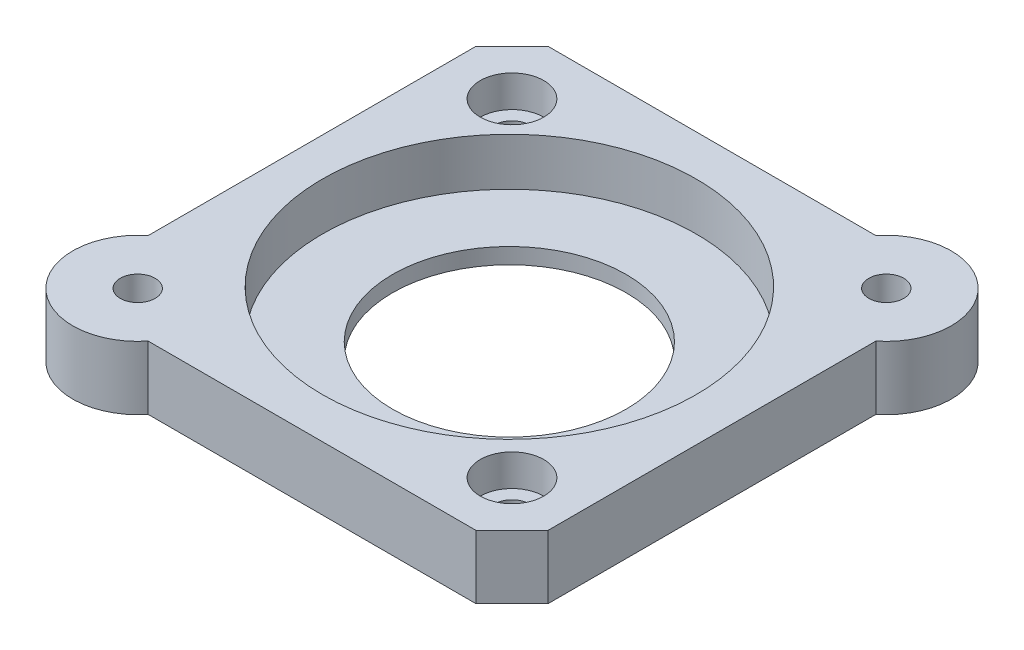
ISO-10303-21;
HEADER;
FILE_DESCRIPTION(('STEP AP214'),'2;1');
FILE_NAME('part.step','',(''),(''),'','','');
FILE_SCHEMA(('AUTOMOTIVE_DESIGN { 1 0 10303 214 1 1 1 1 }'));
ENDSEC;
DATA;
#1=APPLICATION_CONTEXT('core data for automotive mechanical design processes');
#2=APPLICATION_PROTOCOL_DEFINITION('international standard','automotive_design',2000,#1);
#3=PRODUCT_CONTEXT('',#1,'mechanical');
#4=PRODUCT('Part','Part','',(#3));
#5=PRODUCT_RELATED_PRODUCT_CATEGORY('part','',(#4));
#6=PRODUCT_DEFINITION_FORMATION('','',#4);
#7=PRODUCT_DEFINITION_CONTEXT('part definition',#1,'design');
#8=PRODUCT_DEFINITION('design','',#6,#7);
#9=PRODUCT_DEFINITION_SHAPE('','',#8);
#10=(LENGTH_UNIT() NAMED_UNIT(*) SI_UNIT(.MILLI.,.METRE.));
#11=(NAMED_UNIT(*) PLANE_ANGLE_UNIT() SI_UNIT($,.RADIAN.));
#12=(NAMED_UNIT(*) SI_UNIT($,.STERADIAN.) SOLID_ANGLE_UNIT());
#13=UNCERTAINTY_MEASURE_WITH_UNIT(LENGTH_MEASURE(1.E-05),#10,'distance_accuracy_value','');
#14=(GEOMETRIC_REPRESENTATION_CONTEXT(3) GLOBAL_UNCERTAINTY_ASSIGNED_CONTEXT((#13)) GLOBAL_UNIT_ASSIGNED_CONTEXT((#10,
#11,#12)) REPRESENTATION_CONTEXT('',''));
#15=CARTESIAN_POINT('',(0.,0.,0.));
#16=DIRECTION('',(0.,0.,1.));
#17=DIRECTION('',(1.,0.,0.));
#18=AXIS2_PLACEMENT_3D('',#15,#16,#17);
#19=CARTESIAN_POINT('',(0.,-80.5,0.));
#20=DIRECTION('',(0.,1.,0.));
#21=DIRECTION('',(0.,0.,1.));
#22=AXIS2_PLACEMENT_3D('',#19,#20,#21);
#23=PLANE('',#22);
#24=DIRECTION('',(-0.685850151932708,0.,-0.727742790478808));
#25=VECTOR('',#24,1.);
#26=CARTESIAN_POINT('',(-11.2075412958888,-80.5,10.5623772590314));
#27=LINE('',#26,#25);
#28=CARTESIAN_POINT('',(-33.8388541018935,-80.5,-13.4512862026288));
#29=VERTEX_POINT('',#28);
#30=CARTESIAN_POINT('',(-36.6106844907881,-80.5,-16.3924236745151));
#31=VERTEX_POINT('',#30);
#32=EDGE_CURVE('E203',#29,#31,#27,.T.);
#33=ORIENTED_EDGE('',*,*,#32,.F.);
#34=DIRECTION('',(-0.973168819941978,0.,0.230092259523735));
#35=VECTOR('',#34,1.);
#36=CARTESIAN_POINT('',(-4.80350511527349,-80.5,-20.3162914488818));
#37=LINE('',#36,#35);
#38=CARTESIAN_POINT('',(-29.9058391407703,-80.5,-14.3811929984501));
#39=VERTEX_POINT('',#38);
#40=EDGE_CURVE('E34',#39,#29,#37,.T.);
#41=ORIENTED_EDGE('',*,*,#40,.F.);
#42=DIRECTION('',(-0.287318668009273,0.,0.957835050002545));
#43=VECTOR('',#42,1.);
#44=CARTESIAN_POINT('',(-31.3948120666689,-80.5,-9.41739977606038));
#45=LINE('',#44,#43);
#46=CARTESIAN_POINT('',(-28.7446545685418,-80.5,-18.2522372661578));
#47=VERTEX_POINT('',#46);
#48=EDGE_CURVE('E187',#47,#39,#45,.T.);
#49=ORIENTED_EDGE('',*,*,#48,.F.);
#50=DIRECTION('',(0.685850151932706,0.,0.727742790478809));
#51=VECTOR('',#50,1.);
#52=CARTESIAN_POINT('',(-6.11334176253722,-80.5,5.76142619550251));
#53=LINE('',#52,#51);
#54=CARTESIAN_POINT('',(-31.5164849574365,-80.5,-21.193374738044));
#55=VERTEX_POINT('',#54);
#56=EDGE_CURVE('E214',#55,#47,#53,.T.);
#57=ORIENTED_EDGE('',*,*,#56,.F.);
#58=DIRECTION('',(0.973168819941978,0.,-0.230092259523735));
#59=VECTOR('',#58,1.);
#60=CARTESIAN_POINT('',(-6.41415093193965,-80.5,-27.1284731884757));
#61=LINE('',#60,#59);
#62=CARTESIAN_POINT('',(-35.4494999185596,-80.5,-20.2634679422227));
#63=VERTEX_POINT('',#62);
#64=EDGE_CURVE('E210',#63,#55,#61,.T.);
#65=ORIENTED_EDGE('',*,*,#64,.F.);
#66=DIRECTION('',(0.287318668009273,0.,-0.957835050002545));
#67=VECTOR('',#66,1.);
#68=CARTESIAN_POINT('',(-38.0996574166867,-80.5,-11.4286304521253));
#69=LINE('',#68,#67);
#70=EDGE_CURVE('E206',#31,#63,#69,.T.);
#71=ORIENTED_EDGE('',*,*,#70,.F.);
#72=EDGE_LOOP('',(#33,#41,#49,#57,#65,#71));
#73=FACE_BOUND('',#72,.T.);
#74=CARTESIAN_POINT('',(-15.2512097709189,-80.5,-35.));
#75=DIRECTION('',(0.,1.,0.));
#76=DIRECTION('',(0.,0.,1.));
#77=AXIS2_PLACEMENT_3D('',#74,#75,#76);
#78=CIRCLE('',#77,11.03);
#79=CARTESIAN_POINT('',(-15.2512097709189,-80.5,-23.97));
#80=VERTEX_POINT('',#79);
#81=EDGE_CURVE('E403',#80,#80,#78,.T.);
#82=ORIENTED_EDGE('',*,*,#81,.T.);
#83=EDGE_LOOP('',(#82));
#84=FACE_BOUND('',#83,.T.);
#85=CARTESIAN_POINT('',(-30.5,-80.5,-50.5));
#86=DIRECTION('',(0.,1.,0.));
#87=DIRECTION('',(0.,0.,1.));
#88=AXIS2_PLACEMENT_3D('',#85,#86,#87);
#89=CIRCLE('',#88,1.7);
#90=CARTESIAN_POINT('',(-30.5,-80.5,-48.8));
#91=VERTEX_POINT('',#90);
#92=EDGE_CURVE('E379',#91,#91,#89,.T.);
#93=ORIENTED_EDGE('',*,*,#92,.T.);
#94=EDGE_LOOP('',(#93));
#95=FACE_BOUND('',#94,.T.);
#96=CARTESIAN_POINT('',(0.499999999999988,-80.5,-19.5));
#97=DIRECTION('',(0.,1.,0.));
#98=DIRECTION('',(0.,0.,1.));
#99=AXIS2_PLACEMENT_3D('',#96,#97,#98);
#100=CIRCLE('',#99,1.7);
#101=CARTESIAN_POINT('',(0.499999999999988,-80.5,-17.8));
#102=VERTEX_POINT('',#101);
#103=EDGE_CURVE('E363',#102,#102,#100,.T.);
#104=ORIENTED_EDGE('',*,*,#103,.T.);
#105=EDGE_LOOP('',(#104));
#106=FACE_BOUND('',#105,.T.);
#107=DIRECTION('',(1.,0.,0.));
#108=VECTOR('',#107,1.);
#109=CARTESIAN_POINT('',(-36.5,-80.5,-13.5));
#110=LINE('',#109,#108);
#111=CARTESIAN_POINT('',(-27.8760822243164,-80.5,-13.5));
#112=VERTEX_POINT('',#111);
#113=CARTESIAN_POINT('',(3.09797974644665,-80.5,-13.5));
#114=VERTEX_POINT('',#113);
#115=EDGE_CURVE('E408',#112,#114,#110,.T.);
#116=ORIENTED_EDGE('',*,*,#115,.F.);
#117=CARTESIAN_POINT('',(-32.677669529665,-80.5,-17.3223304703364));
#118=DIRECTION('',(0.,1.,0.));
#119=DIRECTION('',(0.,0.,1.));
#120=AXIS2_PLACEMENT_3D('',#117,#118,#119);
#121=CIRCLE('',#120,6.13721849662746);
#122=CARTESIAN_POINT('',(-36.5,-80.5,-22.123917775686));
#123=VERTEX_POINT('',#122);
#124=EDGE_CURVE('E294',#112,#123,#121,.F.);
#125=ORIENTED_EDGE('',*,*,#124,.T.);
#126=DIRECTION('',(0.,0.,1.));
#127=VECTOR('',#126,1.);
#128=CARTESIAN_POINT('',(-36.5,-80.5,-56.5));
#129=LINE('',#128,#127);
#130=CARTESIAN_POINT('',(-36.5,-80.5,-53.0979797464467));
#131=VERTEX_POINT('',#130);
#132=EDGE_CURVE('E10',#131,#123,#129,.T.);
#133=ORIENTED_EDGE('',*,*,#132,.F.);
#134=DIRECTION('',(0.707106781186547,0.,-0.707106781186548));
#135=VECTOR('',#134,1.);
#136=CARTESIAN_POINT('',(-44.7989898732234,-80.5,-44.7989898732233));
#137=LINE('',#136,#135);
#138=CARTESIAN_POINT('',(-33.0979797464467,-80.5,-56.5));
#139=VERTEX_POINT('',#138);
#140=EDGE_CURVE('E347',#131,#139,#137,.T.);
#141=ORIENTED_EDGE('',*,*,#140,.T.);
#142=DIRECTION('',(-1.,0.,0.));
#143=VECTOR('',#142,1.);
#144=CARTESIAN_POINT('',(6.5,-80.5,-56.5));
#145=LINE('',#144,#143);
#146=CARTESIAN_POINT('',(-2.12391777568599,-80.5,-56.5));
#147=VERTEX_POINT('',#146);
#148=EDGE_CURVE('E26',#147,#139,#145,.T.);
#149=ORIENTED_EDGE('',*,*,#148,.F.);
#150=CARTESIAN_POINT('',(2.6776695296636,-80.5,-52.677669529665));
#151=DIRECTION('',(0.,1.,0.));
#152=DIRECTION('',(0.,0.,1.));
#153=AXIS2_PLACEMENT_3D('',#150,#151,#152);
#154=CIRCLE('',#153,6.13721849662746);
#155=CARTESIAN_POINT('',(6.5,-80.5,-47.8760822243164));
#156=VERTEX_POINT('',#155);
#157=EDGE_CURVE('E308',#156,#147,#154,.T.);
#158=ORIENTED_EDGE('',*,*,#157,.F.);
#159=DIRECTION('',(0.,0.,-1.));
#160=VECTOR('',#159,1.);
#161=CARTESIAN_POINT('',(6.5,-80.5,-13.5));
#162=LINE('',#161,#160);
#163=CARTESIAN_POINT('',(6.5,-80.5,-16.9020202535533));
#164=VERTEX_POINT('',#163);
#165=EDGE_CURVE('E411',#164,#156,#162,.T.);
#166=ORIENTED_EDGE('',*,*,#165,.F.);
#167=DIRECTION('',(0.707106781186547,0.,-0.707106781186548));
#168=VECTOR('',#167,1.);
#169=CARTESIAN_POINT('',(-5.20101012677668,-80.5,-5.20101012677667));
#170=LINE('',#169,#168);
#171=EDGE_CURVE('E335',#114,#164,#170,.T.);
#172=ORIENTED_EDGE('',*,*,#171,.F.);
#173=EDGE_LOOP('',(#116,#125,#133,#141,#149,#158,#166,#172));
#174=FACE_BOUND('',#173,.T.);
#175=DIRECTION('',(0.957835050002544,0.,-0.287318668009275));
#176=VECTOR('',#175,1.);
#177=CARTESIAN_POINT('',(1.74776273384226,-80.5,-48.7446545685418));
#178=LINE('',#177,#176);
#179=CARTESIAN_POINT('',(1.74776273384226,-80.5,-48.7446545685418));
#180=VERTEX_POINT('',#179);
#181=CARTESIAN_POINT('',(5.61880700154985,-80.5,-49.9058391407703));
#182=VERTEX_POINT('',#181);
#183=EDGE_CURVE('E42',#180,#182,#178,.T.);
#184=ORIENTED_EDGE('',*,*,#183,.T.);
#185=DIRECTION('',(0.230092259523736,0.,-0.973168819941978));
#186=VECTOR('',#185,1.);
#187=CARTESIAN_POINT('',(5.61880700154985,-80.5,-49.9058391407703));
#188=LINE('',#187,#186);
#189=CARTESIAN_POINT('',(6.5487137973712,-80.5,-53.8388541018934));
#190=VERTEX_POINT('',#189);
#191=EDGE_CURVE('E271',#182,#190,#188,.T.);
#192=ORIENTED_EDGE('',*,*,#191,.T.);
#193=DIRECTION('',(-0.727742790478809,0.,-0.685850151932706));
#194=VECTOR('',#193,1.);
#195=CARTESIAN_POINT('',(6.5487137973712,-80.5,-53.8388541018934));
#196=LINE('',#195,#194);
#197=CARTESIAN_POINT('',(3.60757632548494,-80.5,-56.6106844907881));
#198=VERTEX_POINT('',#197);
#199=EDGE_CURVE('E267',#190,#198,#196,.T.);
#200=ORIENTED_EDGE('',*,*,#199,.T.);
#201=DIRECTION('',(-0.957835050002545,0.,0.287318668009273));
#202=VECTOR('',#201,1.);
#203=CARTESIAN_POINT('',(3.60757632548494,-80.5,-56.6106844907881));
#204=LINE('',#203,#202);
#205=CARTESIAN_POINT('',(-0.263467942222658,-80.5,-55.4494999185596));
#206=VERTEX_POINT('',#205);
#207=EDGE_CURVE('E263',#198,#206,#204,.T.);
#208=ORIENTED_EDGE('',*,*,#207,.T.);
#209=DIRECTION('',(-0.230092259523735,0.,0.973168819941978));
#210=VECTOR('',#209,1.);
#211=CARTESIAN_POINT('',(-0.263467942222658,-80.5,-55.4494999185596));
#212=LINE('',#211,#210);
#213=CARTESIAN_POINT('',(-1.193374738044,-80.5,-51.5164849574364));
#214=VERTEX_POINT('',#213);
#215=EDGE_CURVE('E258',#206,#214,#212,.T.);
#216=ORIENTED_EDGE('',*,*,#215,.T.);
#217=DIRECTION('',(0.727742790478811,0.,0.685850151932704));
#218=VECTOR('',#217,1.);
#219=CARTESIAN_POINT('',(-1.193374738044,-80.5,-51.5164849574364));
#220=LINE('',#219,#218);
#221=EDGE_CURVE('E254',#214,#180,#220,.T.);
#222=ORIENTED_EDGE('',*,*,#221,.T.);
#223=EDGE_LOOP('',(#184,#192,#200,#208,#216,#222));
#224=FACE_BOUND('',#223,.T.);
#225=ADVANCED_FACE('F16',(#73,#84,#95,#106,#174,#224),#23,.F.);
#226=CARTESIAN_POINT('',(-32.677669529665,-80.5,-17.3223304703364));
#227=DIRECTION('',(0.,-1.,0.));
#228=DIRECTION('',(0.,0.,-1.));
#229=AXIS2_PLACEMENT_3D('',#226,#227,#228);
#230=CYLINDRICAL_SURFACE('',#229,1.64999999999995);
#231=CARTESIAN_POINT('',(-32.677669529665,-74.5,-17.3223304703364));
#232=DIRECTION('',(0.,-1.,0.));
#233=DIRECTION('',(0.,0.,-1.));
#234=AXIS2_PLACEMENT_3D('',#231,#232,#233);
#235=CIRCLE('',#234,1.64999999999995);
#236=CARTESIAN_POINT('',(-32.677669529665,-74.5,-18.9723304703364));
#237=VERTEX_POINT('',#236);
#238=EDGE_CURVE('E387',#237,#237,#235,.T.);
#239=ORIENTED_EDGE('',*,*,#238,.F.);
#240=EDGE_LOOP('',(#239));
#241=FACE_BOUND('',#240,.T.);
#242=CARTESIAN_POINT('',(-32.677669529665,-77.3,-17.3223304703364));
#243=DIRECTION('',(0.,-1.,0.));
#244=DIRECTION('',(0.,0.,-1.));
#245=AXIS2_PLACEMENT_3D('',#242,#243,#244);
#246=CIRCLE('',#245,1.64999999999995);
#247=CARTESIAN_POINT('',(-32.677669529665,-77.3,-18.9723304703364));
#248=VERTEX_POINT('',#247);
#249=EDGE_CURVE('E182',#248,#248,#246,.F.);
#250=ORIENTED_EDGE('',*,*,#249,.F.);
#251=EDGE_LOOP('',(#250));
#252=FACE_BOUND('',#251,.T.);
#253=ADVANCED_FACE('F480',(#241,#252),#230,.F.);
#254=CARTESIAN_POINT('',(-36.5,-80.5,-14.5));
#255=DIRECTION('',(-1.,0.,0.));
#256=DIRECTION('',(0.,0.,1.));
#257=AXIS2_PLACEMENT_3D('',#254,#255,#256);
#258=PLANE('',#257);
#259=ORIENTED_EDGE('',*,*,#132,.T.);
#260=DIRECTION('',(0.,1.,0.));
#261=VECTOR('',#260,1.);
#262=CARTESIAN_POINT('',(-36.5,-80.5,-22.123917775686));
#263=LINE('',#262,#261);
#264=CARTESIAN_POINT('',(-36.5,-74.5,-22.123917775686));
#265=VERTEX_POINT('',#264);
#266=EDGE_CURVE('E301',#123,#265,#263,.T.);
#267=ORIENTED_EDGE('',*,*,#266,.T.);
#268=DIRECTION('',(0.,0.,1.));
#269=VECTOR('',#268,1.);
#270=CARTESIAN_POINT('',(-36.5,-74.5,-14.5));
#271=LINE('',#270,#269);
#272=CARTESIAN_POINT('',(-36.5,-74.5,-53.0979797464467));
#273=VERTEX_POINT('',#272);
#274=EDGE_CURVE('E412',#273,#265,#271,.T.);
#275=ORIENTED_EDGE('',*,*,#274,.F.);
#276=DIRECTION('',(0.,1.,0.));
#277=VECTOR('',#276,1.);
#278=CARTESIAN_POINT('',(-36.5,-84.5,-53.0979797464467));
#279=LINE('',#278,#277);
#280=EDGE_CURVE('E320',#131,#273,#279,.T.);
#281=ORIENTED_EDGE('',*,*,#280,.F.);
#282=EDGE_LOOP('',(#259,#267,#275,#281));
#283=FACE_BOUND('',#282,.T.);
#284=ADVANCED_FACE('F436',(#283),#258,.T.);
#285=CARTESIAN_POINT('',(5.5,-80.5,-13.5));
#286=DIRECTION('',(0.,0.,1.));
#287=DIRECTION('',(1.,0.,0.));
#288=AXIS2_PLACEMENT_3D('',#285,#286,#287);
#289=PLANE('',#288);
#290=DIRECTION('',(1.,0.,0.));
#291=VECTOR('',#290,1.);
#292=CARTESIAN_POINT('',(5.5,-74.5,-13.5));
#293=LINE('',#292,#291);
#294=CARTESIAN_POINT('',(-27.8760822243164,-74.5,-13.5));
#295=VERTEX_POINT('',#294);
#296=CARTESIAN_POINT('',(3.09797974644665,-74.5,-13.5));
#297=VERTEX_POINT('',#296);
#298=EDGE_CURVE('E407',#295,#297,#293,.T.);
#299=ORIENTED_EDGE('',*,*,#298,.F.);
#300=DIRECTION('',(0.,1.,0.));
#301=VECTOR('',#300,1.);
#302=CARTESIAN_POINT('',(-27.8760822243164,-80.5,-13.5));
#303=LINE('',#302,#301);
#304=EDGE_CURVE('E297',#112,#295,#303,.T.);
#305=ORIENTED_EDGE('',*,*,#304,.F.);
#306=ORIENTED_EDGE('',*,*,#115,.T.);
#307=DIRECTION('',(0.,1.,0.));
#308=VECTOR('',#307,1.);
#309=CARTESIAN_POINT('',(3.09797974644665,-84.5,-13.5));
#310=LINE('',#309,#308);
#311=EDGE_CURVE('E323',#114,#297,#310,.T.);
#312=ORIENTED_EDGE('',*,*,#311,.T.);
#313=EDGE_LOOP('',(#299,#305,#306,#312));
#314=FACE_BOUND('',#313,.T.);
#315=ADVANCED_FACE('F18',(#314),#289,.T.);
#316=CARTESIAN_POINT('',(6.5,-80.5,-55.5));
#317=DIRECTION('',(1.,0.,0.));
#318=DIRECTION('',(0.,0.,-1.));
#319=AXIS2_PLACEMENT_3D('',#316,#317,#318);
#320=PLANE('',#319);
#321=DIRECTION('',(0.,1.,0.));
#322=VECTOR('',#321,1.);
#323=CARTESIAN_POINT('',(6.5,-80.5,-47.8760822243164));
#324=LINE('',#323,#322);
#325=CARTESIAN_POINT('',(6.5,-74.5,-47.8760822243164));
#326=VERTEX_POINT('',#325);
#327=EDGE_CURVE('E312',#156,#326,#324,.T.);
#328=ORIENTED_EDGE('',*,*,#327,.T.);
#329=DIRECTION('',(0.,0.,-1.));
#330=VECTOR('',#329,1.);
#331=CARTESIAN_POINT('',(6.5,-74.5,-55.5));
#332=LINE('',#331,#330);
#333=CARTESIAN_POINT('',(6.5,-74.5,-16.9020202535533));
#334=VERTEX_POINT('',#333);
#335=EDGE_CURVE('E419',#334,#326,#332,.T.);
#336=ORIENTED_EDGE('',*,*,#335,.F.);
#337=DIRECTION('',(0.,1.,0.));
#338=VECTOR('',#337,1.);
#339=CARTESIAN_POINT('',(6.5,-84.5,-16.9020202535533));
#340=LINE('',#339,#338);
#341=EDGE_CURVE('E327',#164,#334,#340,.T.);
#342=ORIENTED_EDGE('',*,*,#341,.F.);
#343=ORIENTED_EDGE('',*,*,#165,.T.);
#344=EDGE_LOOP('',(#328,#336,#342,#343));
#345=FACE_BOUND('',#344,.T.);
#346=ADVANCED_FACE('F456',(#345),#320,.T.);
#347=CARTESIAN_POINT('',(0.,-74.5,0.));
#348=DIRECTION('',(0.,1.,0.));
#349=DIRECTION('',(0.,0.,1.));
#350=AXIS2_PLACEMENT_3D('',#347,#348,#349);
#351=PLANE('',#350);
#352=CARTESIAN_POINT('',(-32.677669529665,-74.5,-17.3223304703364));
#353=DIRECTION('',(0.,1.,0.));
#354=DIRECTION('',(0.,0.,1.));
#355=AXIS2_PLACEMENT_3D('',#352,#353,#354);
#356=CIRCLE('',#355,6.13721849662746);
#357=EDGE_CURVE('E298',#295,#265,#356,.F.);
#358=ORIENTED_EDGE('',*,*,#357,.F.);
#359=ORIENTED_EDGE('',*,*,#298,.T.);
#360=DIRECTION('',(0.707106781186547,0.,-0.707106781186548));
#361=VECTOR('',#360,1.);
#362=CARTESIAN_POINT('',(3.09797974644665,-74.5,-13.5));
#363=LINE('',#362,#361);
#364=EDGE_CURVE('E331',#297,#334,#363,.T.);
#365=ORIENTED_EDGE('',*,*,#364,.T.);
#366=ORIENTED_EDGE('',*,*,#335,.T.);
#367=CARTESIAN_POINT('',(2.6776695296636,-74.5,-52.677669529665));
#368=DIRECTION('',(0.,1.,0.));
#369=DIRECTION('',(0.,0.,1.));
#370=AXIS2_PLACEMENT_3D('',#367,#368,#369);
#371=CIRCLE('',#370,6.13721849662746);
#372=CARTESIAN_POINT('',(-2.12391777568599,-74.5,-56.5));
#373=VERTEX_POINT('',#372);
#374=EDGE_CURVE('E305',#326,#373,#371,.T.);
#375=ORIENTED_EDGE('',*,*,#374,.T.);
#376=DIRECTION('',(-1.,0.,0.));
#377=VECTOR('',#376,1.);
#378=CARTESIAN_POINT('',(-35.5,-74.5,-56.5));
#379=LINE('',#378,#377);
#380=CARTESIAN_POINT('',(-33.0979797464467,-74.5,-56.5));
#381=VERTEX_POINT('',#380);
#382=EDGE_CURVE('E423',#373,#381,#379,.T.);
#383=ORIENTED_EDGE('',*,*,#382,.T.);
#384=DIRECTION('',(0.707106781186547,0.,-0.707106781186548));
#385=VECTOR('',#384,1.);
#386=CARTESIAN_POINT('',(-36.5,-74.5,-53.0979797464467));
#387=LINE('',#386,#385);
#388=EDGE_CURVE('E328',#273,#381,#387,.T.);
#389=ORIENTED_EDGE('',*,*,#388,.F.);
#390=ORIENTED_EDGE('',*,*,#274,.T.);
#391=EDGE_LOOP('',(#358,#359,#365,#366,#375,#383,#389,#390));
#392=FACE_BOUND('',#391,.T.);
#393=CARTESIAN_POINT('',(0.499999999999988,-74.5,-19.5));
#394=DIRECTION('',(0.,1.,0.));
#395=DIRECTION('',(0.,0.,1.));
#396=AXIS2_PLACEMENT_3D('',#393,#394,#395);
#397=CIRCLE('',#396,3.);
#398=CARTESIAN_POINT('',(0.499999999999988,-74.5,-16.5));
#399=VERTEX_POINT('',#398);
#400=EDGE_CURVE('E351',#399,#399,#397,.T.);
#401=ORIENTED_EDGE('',*,*,#400,.F.);
#402=EDGE_LOOP('',(#401));
#403=FACE_BOUND('',#402,.T.);
#404=CARTESIAN_POINT('',(-30.5,-74.5,-50.5));
#405=DIRECTION('',(0.,1.,0.));
#406=DIRECTION('',(0.,0.,1.));
#407=AXIS2_PLACEMENT_3D('',#404,#405,#406);
#408=CIRCLE('',#407,3.);
#409=CARTESIAN_POINT('',(-30.5,-74.5,-47.5));
#410=VERTEX_POINT('',#409);
#411=EDGE_CURVE('E367',#410,#410,#408,.T.);
#412=ORIENTED_EDGE('',*,*,#411,.F.);
#413=EDGE_LOOP('',(#412));
#414=FACE_BOUND('',#413,.T.);
#415=CARTESIAN_POINT('',(2.67766952966269,-74.5,-52.6776695296635));
#416=DIRECTION('',(0.,-1.,0.));
#417=DIRECTION('',(0.,0.,-1.));
#418=AXIS2_PLACEMENT_3D('',#415,#416,#417);
#419=CIRCLE('',#418,1.64999999999996);
#420=CARTESIAN_POINT('',(2.67766952966269,-74.5,-54.3276695296635));
#421=VERTEX_POINT('',#420);
#422=EDGE_CURVE('E383',#421,#421,#419,.T.);
#423=ORIENTED_EDGE('',*,*,#422,.T.);
#424=EDGE_LOOP('',(#423));
#425=FACE_BOUND('',#424,.T.);
#426=ORIENTED_EDGE('',*,*,#238,.T.);
#427=EDGE_LOOP('',(#426));
#428=FACE_BOUND('',#427,.T.);
#429=CARTESIAN_POINT('',(-15.2512097709189,-74.5,-35.));
#430=DIRECTION('',(0.,1.,0.));
#431=DIRECTION('',(0.,0.,1.));
#432=AXIS2_PLACEMENT_3D('',#429,#430,#431);
#433=CIRCLE('',#432,17.65);
#434=CARTESIAN_POINT('',(-15.2512097709189,-74.5,-17.35));
#435=VERTEX_POINT('',#434);
#436=EDGE_CURVE('E399',#435,#435,#433,.T.);
#437=ORIENTED_EDGE('',*,*,#436,.F.);
#438=EDGE_LOOP('',(#437));
#439=FACE_BOUND('',#438,.T.);
#440=ADVANCED_FACE('F431',(#392,#403,#414,#425,#428,#439),#351,.T.);
#441=CARTESIAN_POINT('',(-35.5,-80.5,-56.5));
#442=DIRECTION('',(0.,0.,-1.));
#443=DIRECTION('',(-1.,0.,0.));
#444=AXIS2_PLACEMENT_3D('',#441,#442,#443);
#445=PLANE('',#444);
#446=DIRECTION('',(0.,1.,0.));
#447=VECTOR('',#446,1.);
#448=CARTESIAN_POINT('',(-2.12391777568599,-80.5,-56.5));
#449=LINE('',#448,#447);
#450=EDGE_CURVE('E316',#147,#373,#449,.T.);
#451=ORIENTED_EDGE('',*,*,#450,.F.);
#452=ORIENTED_EDGE('',*,*,#148,.T.);
#453=DIRECTION('',(0.,1.,0.));
#454=VECTOR('',#453,1.);
#455=CARTESIAN_POINT('',(-33.0979797464467,-84.5,-56.5));
#456=LINE('',#455,#454);
#457=EDGE_CURVE('E336',#139,#381,#456,.T.);
#458=ORIENTED_EDGE('',*,*,#457,.T.);
#459=ORIENTED_EDGE('',*,*,#382,.F.);
#460=EDGE_LOOP('',(#451,#452,#458,#459));
#461=FACE_BOUND('',#460,.T.);
#462=ADVANCED_FACE('F463',(#461),#445,.T.);
#463=CARTESIAN_POINT('',(-15.2512097709189,-80.500025,-35.));
#464=DIRECTION('',(0.,1.,0.));
#465=DIRECTION('',(0.,0.,1.));
#466=AXIS2_PLACEMENT_3D('',#463,#464,#465);
#467=CYLINDRICAL_SURFACE('',#466,11.03);
#468=ORIENTED_EDGE('',*,*,#81,.F.);
#469=EDGE_LOOP('',(#468));
#470=FACE_BOUND('',#469,.T.);
#471=CARTESIAN_POINT('',(-15.2512097709189,-79.,-35.));
#472=DIRECTION('',(0.,1.,0.));
#473=DIRECTION('',(0.,0.,1.));
#474=AXIS2_PLACEMENT_3D('',#471,#472,#473);
#475=CIRCLE('',#474,11.03);
#476=CARTESIAN_POINT('',(-15.2512097709189,-79.,-23.97));
#477=VERTEX_POINT('',#476);
#478=EDGE_CURVE('E391',#477,#477,#475,.T.);
#479=ORIENTED_EDGE('',*,*,#478,.T.);
#480=EDGE_LOOP('',(#479));
#481=FACE_BOUND('',#480,.T.);
#482=ADVANCED_FACE('F492',(#470,#481),#467,.F.);
#483=CARTESIAN_POINT('',(-15.2512097709189,-80.500025,-35.));
#484=DIRECTION('',(0.,1.,0.));
#485=DIRECTION('',(0.,0.,1.));
#486=AXIS2_PLACEMENT_3D('',#483,#484,#485);
#487=CYLINDRICAL_SURFACE('',#486,17.65);
#488=CARTESIAN_POINT('',(-15.2512097709189,-79.,-35.));
#489=DIRECTION('',(0.,1.,0.));
#490=DIRECTION('',(0.,0.,1.));
#491=AXIS2_PLACEMENT_3D('',#488,#489,#490);
#492=CIRCLE('',#491,17.65);
#493=CARTESIAN_POINT('',(-15.2512097709189,-79.,-17.35));
#494=VERTEX_POINT('',#493);
#495=EDGE_CURVE('E395',#494,#494,#492,.T.);
#496=ORIENTED_EDGE('',*,*,#495,.F.);
#497=EDGE_LOOP('',(#496));
#498=FACE_BOUND('',#497,.T.);
#499=ORIENTED_EDGE('',*,*,#436,.T.);
#500=EDGE_LOOP('',(#499));
#501=FACE_BOUND('',#500,.T.);
#502=ADVANCED_FACE('F547',(#498,#501),#487,.F.);
#503=CARTESIAN_POINT('',(2.39879022908112,-79.,-35.));
#504=DIRECTION('',(0.,-1.,0.));
#505=DIRECTION('',(0.,0.,-1.));
#506=AXIS2_PLACEMENT_3D('',#503,#504,#505);
#507=PLANE('',#506);
#508=ORIENTED_EDGE('',*,*,#478,.F.);
#509=EDGE_LOOP('',(#508));
#510=FACE_BOUND('',#509,.T.);
#511=ORIENTED_EDGE('',*,*,#495,.T.);
#512=EDGE_LOOP('',(#511));
#513=FACE_BOUND('',#512,.T.);
#514=ADVANCED_FACE('F556',(#510,#513),#507,.F.);
#515=CARTESIAN_POINT('',(2.67766952966269,-80.5,-52.6776695296635));
#516=DIRECTION('',(0.,-1.,0.));
#517=DIRECTION('',(0.,0.,-1.));
#518=AXIS2_PLACEMENT_3D('',#515,#516,#517);
#519=CYLINDRICAL_SURFACE('',#518,1.64999999999996);
#520=CARTESIAN_POINT('',(2.67766952966269,-77.3,-52.6776695296635));
#521=DIRECTION('',(0.,1.,0.));
#522=DIRECTION('',(0.,0.,1.));
#523=AXIS2_PLACEMENT_3D('',#520,#521,#522);
#524=CIRCLE('',#523,1.64999999999996);
#525=CARTESIAN_POINT('',(2.67766952966269,-77.3,-51.0276695296635));
#526=VERTEX_POINT('',#525);
#527=EDGE_CURVE('E20',#526,#526,#524,.F.);
#528=ORIENTED_EDGE('',*,*,#527,.T.);
#529=EDGE_LOOP('',(#528));
#530=FACE_BOUND('',#529,.T.);
#531=ORIENTED_EDGE('',*,*,#422,.F.);
#532=EDGE_LOOP('',(#531));
#533=FACE_BOUND('',#532,.T.);
#534=ADVANCED_FACE('F564',(#530,#533),#519,.F.);
#535=CARTESIAN_POINT('',(-30.5,-74.5,-50.5));
#536=DIRECTION('',(0.,1.,0.));
#537=DIRECTION('',(0.,0.,1.));
#538=AXIS2_PLACEMENT_3D('',#535,#536,#537);
#539=CYLINDRICAL_SURFACE('',#538,1.7);
#540=ORIENTED_EDGE('',*,*,#92,.F.);
#541=EDGE_LOOP('',(#540));
#542=FACE_BOUND('',#541,.T.);
#543=CARTESIAN_POINT('',(-30.5,-77.5,-50.5));
#544=DIRECTION('',(0.,1.,0.));
#545=DIRECTION('',(0.,0.,1.));
#546=AXIS2_PLACEMENT_3D('',#543,#544,#545);
#547=CIRCLE('',#546,1.7);
#548=CARTESIAN_POINT('',(-30.5,-77.5,-48.8));
#549=VERTEX_POINT('',#548);
#550=EDGE_CURVE('E375',#549,#549,#547,.T.);
#551=ORIENTED_EDGE('',*,*,#550,.T.);
#552=EDGE_LOOP('',(#551));
#553=FACE_BOUND('',#552,.T.);
#554=ADVANCED_FACE('F573',(#542,#553),#539,.F.);
#555=CARTESIAN_POINT('',(-28.8,-77.5,-50.5));
#556=DIRECTION('',(0.,-1.,0.));
#557=DIRECTION('',(0.,0.,-1.));
#558=AXIS2_PLACEMENT_3D('',#555,#556,#557);
#559=PLANE('',#558);
#560=ORIENTED_EDGE('',*,*,#550,.F.);
#561=EDGE_LOOP('',(#560));
#562=FACE_BOUND('',#561,.T.);
#563=CARTESIAN_POINT('',(-30.5,-77.5,-50.5));
#564=DIRECTION('',(0.,1.,0.));
#565=DIRECTION('',(0.,0.,1.));
#566=AXIS2_PLACEMENT_3D('',#563,#564,#565);
#567=CIRCLE('',#566,3.);
#568=CARTESIAN_POINT('',(-30.5,-77.5,-47.5));
#569=VERTEX_POINT('',#568);
#570=EDGE_CURVE('E371',#569,#569,#567,.T.);
#571=ORIENTED_EDGE('',*,*,#570,.T.);
#572=EDGE_LOOP('',(#571));
#573=FACE_BOUND('',#572,.T.);
#574=ADVANCED_FACE('F582',(#562,#573),#559,.F.);
#575=CARTESIAN_POINT('',(-30.5,-74.5,-50.5));
#576=DIRECTION('',(0.,1.,0.));
#577=DIRECTION('',(0.,0.,1.));
#578=AXIS2_PLACEMENT_3D('',#575,#576,#577);
#579=CYLINDRICAL_SURFACE('',#578,3.);
#580=ORIENTED_EDGE('',*,*,#570,.F.);
#581=EDGE_LOOP('',(#580));
#582=FACE_BOUND('',#581,.T.);
#583=ORIENTED_EDGE('',*,*,#411,.T.);
#584=EDGE_LOOP('',(#583));
#585=FACE_BOUND('',#584,.T.);
#586=ADVANCED_FACE('F591',(#582,#585),#579,.F.);
#587=CARTESIAN_POINT('',(0.499999999999988,-74.5,-19.5));
#588=DIRECTION('',(0.,1.,0.));
#589=DIRECTION('',(0.,0.,1.));
#590=AXIS2_PLACEMENT_3D('',#587,#588,#589);
#591=CYLINDRICAL_SURFACE('',#590,1.7);
#592=ORIENTED_EDGE('',*,*,#103,.F.);
#593=EDGE_LOOP('',(#592));
#594=FACE_BOUND('',#593,.T.);
#595=CARTESIAN_POINT('',(0.499999999999988,-77.5,-19.5));
#596=DIRECTION('',(0.,1.,0.));
#597=DIRECTION('',(0.,0.,1.));
#598=AXIS2_PLACEMENT_3D('',#595,#596,#597);
#599=CIRCLE('',#598,1.7);
#600=CARTESIAN_POINT('',(0.499999999999988,-77.5,-17.8));
#601=VERTEX_POINT('',#600);
#602=EDGE_CURVE('E359',#601,#601,#599,.T.);
#603=ORIENTED_EDGE('',*,*,#602,.T.);
#604=EDGE_LOOP('',(#603));
#605=FACE_BOUND('',#604,.T.);
#606=ADVANCED_FACE('F600',(#594,#605),#591,.F.);
#607=CARTESIAN_POINT('',(2.2,-77.5,-19.5));
#608=DIRECTION('',(0.,-1.,0.));
#609=DIRECTION('',(0.,0.,-1.));
#610=AXIS2_PLACEMENT_3D('',#607,#608,#609);
#611=PLANE('',#610);
#612=ORIENTED_EDGE('',*,*,#602,.F.);
#613=EDGE_LOOP('',(#612));
#614=FACE_BOUND('',#613,.T.);
#615=CARTESIAN_POINT('',(0.499999999999988,-77.5,-19.5));
#616=DIRECTION('',(0.,1.,0.));
#617=DIRECTION('',(0.,0.,1.));
#618=AXIS2_PLACEMENT_3D('',#615,#616,#617);
#619=CIRCLE('',#618,3.);
#620=CARTESIAN_POINT('',(0.499999999999988,-77.5,-16.5));
#621=VERTEX_POINT('',#620);
#622=EDGE_CURVE('E355',#621,#621,#619,.T.);
#623=ORIENTED_EDGE('',*,*,#622,.T.);
#624=EDGE_LOOP('',(#623));
#625=FACE_BOUND('',#624,.T.);
#626=ADVANCED_FACE('F609',(#614,#625),#611,.F.);
#627=CARTESIAN_POINT('',(0.499999999999988,-74.5,-19.5));
#628=DIRECTION('',(0.,1.,0.));
#629=DIRECTION('',(0.,0.,1.));
#630=AXIS2_PLACEMENT_3D('',#627,#628,#629);
#631=CYLINDRICAL_SURFACE('',#630,3.);
#632=ORIENTED_EDGE('',*,*,#622,.F.);
#633=EDGE_LOOP('',(#632));
#634=FACE_BOUND('',#633,.T.);
#635=ORIENTED_EDGE('',*,*,#400,.T.);
#636=EDGE_LOOP('',(#635));
#637=FACE_BOUND('',#636,.T.);
#638=ADVANCED_FACE('F476',(#634,#637),#631,.F.);
#639=CARTESIAN_POINT('',(3.09797974644665,-84.5,-13.5));
#640=DIRECTION('',(0.707106781186548,0.,0.707106781186547));
#641=DIRECTION('',(0.707106781186547,0.,-0.707106781186548));
#642=AXIS2_PLACEMENT_3D('',#639,#640,#641);
#643=PLANE('',#642);
#644=ORIENTED_EDGE('',*,*,#171,.T.);
#645=ORIENTED_EDGE('',*,*,#341,.T.);
#646=ORIENTED_EDGE('',*,*,#364,.F.);
#647=ORIENTED_EDGE('',*,*,#311,.F.);
#648=EDGE_LOOP('',(#644,#645,#646,#647));
#649=FACE_BOUND('',#648,.T.);
#650=ADVANCED_FACE('F452',(#649),#643,.T.);
#651=CARTESIAN_POINT('',(-36.5,-84.5,-53.0979797464467));
#652=DIRECTION('',(0.707106781186548,0.,0.707106781186547));
#653=DIRECTION('',(0.707106781186547,0.,-0.707106781186548));
#654=AXIS2_PLACEMENT_3D('',#651,#652,#653);
#655=PLANE('',#654);
#656=ORIENTED_EDGE('',*,*,#280,.T.);
#657=ORIENTED_EDGE('',*,*,#388,.T.);
#658=ORIENTED_EDGE('',*,*,#457,.F.);
#659=ORIENTED_EDGE('',*,*,#140,.F.);
#660=EDGE_LOOP('',(#656,#657,#658,#659));
#661=FACE_BOUND('',#660,.T.);
#662=ADVANCED_FACE('F466',(#661),#655,.F.);
#663=CARTESIAN_POINT('',(2.6776695296636,-80.5,-52.677669529665));
#664=DIRECTION('',(0.,1.,0.));
#665=DIRECTION('',(0.,0.,1.));
#666=AXIS2_PLACEMENT_3D('',#663,#664,#665);
#667=CYLINDRICAL_SURFACE('',#666,6.13721849662746);
#668=ORIENTED_EDGE('',*,*,#374,.F.);
#669=ORIENTED_EDGE('',*,*,#327,.F.);
#670=ORIENTED_EDGE('',*,*,#157,.T.);
#671=ORIENTED_EDGE('',*,*,#450,.T.);
#672=EDGE_LOOP('',(#668,#669,#670,#671));
#673=FACE_BOUND('',#672,.T.);
#674=ADVANCED_FACE('F460',(#673),#667,.T.);
#675=CARTESIAN_POINT('',(-32.677669529665,-80.5,-17.3223304703364));
#676=DIRECTION('',(0.,1.,0.));
#677=DIRECTION('',(0.,0.,1.));
#678=AXIS2_PLACEMENT_3D('',#675,#676,#677);
#679=CYLINDRICAL_SURFACE('',#678,6.13721849662746);
#680=ORIENTED_EDGE('',*,*,#357,.T.);
#681=ORIENTED_EDGE('',*,*,#266,.F.);
#682=ORIENTED_EDGE('',*,*,#124,.F.);
#683=ORIENTED_EDGE('',*,*,#304,.T.);
#684=EDGE_LOOP('',(#680,#681,#682,#683));
#685=FACE_BOUND('',#684,.T.);
#686=ADVANCED_FACE('F440',(#685),#679,.T.);
#687=CARTESIAN_POINT('',(0.,-77.3,0.));
#688=DIRECTION('',(0.,1.,0.));
#689=DIRECTION('',(0.,0.,1.));
#690=AXIS2_PLACEMENT_3D('',#687,#688,#689);
#691=PLANE('',#690);
#692=DIRECTION('',(0.957835050002544,0.,-0.287318668009275));
#693=VECTOR('',#692,1.);
#694=CARTESIAN_POINT('',(1.74776273384226,-77.3,-48.7446545685418));
#695=LINE('',#694,#693);
#696=CARTESIAN_POINT('',(1.74776273384226,-77.3,-48.7446545685418));
#697=VERTEX_POINT('',#696);
#698=CARTESIAN_POINT('',(5.61880700154985,-77.3,-49.9058391407703));
#699=VERTEX_POINT('',#698);
#700=EDGE_CURVE('E259',#697,#699,#695,.T.);
#701=ORIENTED_EDGE('',*,*,#700,.F.);
#702=DIRECTION('',(0.727742790478811,0.,0.685850151932704));
#703=VECTOR('',#702,1.);
#704=CARTESIAN_POINT('',(-1.193374738044,-77.3,-51.5164849574364));
#705=LINE('',#704,#703);
#706=CARTESIAN_POINT('',(-1.193374738044,-77.3,-51.5164849574364));
#707=VERTEX_POINT('',#706);
#708=EDGE_CURVE('E253',#707,#697,#705,.T.);
#709=ORIENTED_EDGE('',*,*,#708,.F.);
#710=DIRECTION('',(-0.230092259523735,0.,0.973168819941978));
#711=VECTOR('',#710,1.);
#712=CARTESIAN_POINT('',(-0.263467942222658,-77.3,-55.4494999185596));
#713=LINE('',#712,#711);
#714=CARTESIAN_POINT('',(-0.263467942222658,-77.3,-55.4494999185596));
#715=VERTEX_POINT('',#714);
#716=EDGE_CURVE('E279',#715,#707,#713,.T.);
#717=ORIENTED_EDGE('',*,*,#716,.F.);
#718=DIRECTION('',(-0.957835050002545,0.,0.287318668009273));
#719=VECTOR('',#718,1.);
#720=CARTESIAN_POINT('',(3.60757632548494,-77.3,-56.6106844907881));
#721=LINE('',#720,#719);
#722=CARTESIAN_POINT('',(3.60757632548494,-77.3,-56.6106844907881));
#723=VERTEX_POINT('',#722);
#724=EDGE_CURVE('E282',#723,#715,#721,.T.);
#725=ORIENTED_EDGE('',*,*,#724,.F.);
#726=DIRECTION('',(-0.727742790478809,0.,-0.685850151932706));
#727=VECTOR('',#726,1.);
#728=CARTESIAN_POINT('',(6.5487137973712,-77.3,-53.8388541018934));
#729=LINE('',#728,#727);
#730=CARTESIAN_POINT('',(6.5487137973712,-77.3,-53.8388541018934));
#731=VERTEX_POINT('',#730);
#732=EDGE_CURVE('E285',#731,#723,#729,.T.);
#733=ORIENTED_EDGE('',*,*,#732,.F.);
#734=DIRECTION('',(0.230092259523736,0.,-0.973168819941978));
#735=VECTOR('',#734,1.);
#736=CARTESIAN_POINT('',(5.61880700154985,-77.3,-49.9058391407703));
#737=LINE('',#736,#735);
#738=EDGE_CURVE('E288',#699,#731,#737,.T.);
#739=ORIENTED_EDGE('',*,*,#738,.F.);
#740=EDGE_LOOP('',(#701,#709,#717,#725,#733,#739));
#741=FACE_BOUND('',#740,.T.);
#742=ORIENTED_EDGE('',*,*,#527,.F.);
#743=EDGE_LOOP('',(#742));
#744=FACE_BOUND('',#743,.T.);
#745=ADVANCED_FACE('F648',(#741,#744),#691,.F.);
#746=CARTESIAN_POINT('',(1.74776273384226,-77.3,-48.7446545685418));
#747=DIRECTION('',(-0.287318668009275,0.,-0.957835050002544));
#748=DIRECTION('',(-0.957835050002544,0.,0.287318668009275));
#749=AXIS2_PLACEMENT_3D('',#746,#747,#748);
#750=PLANE('',#749);
#751=ORIENTED_EDGE('',*,*,#183,.F.);
#752=DIRECTION('',(0.,-1.,0.));
#753=VECTOR('',#752,1.);
#754=CARTESIAN_POINT('',(1.74776273384226,-77.3,-48.7446545685418));
#755=LINE('',#754,#753);
#756=EDGE_CURVE('E250',#697,#180,#755,.T.);
#757=ORIENTED_EDGE('',*,*,#756,.F.);
#758=ORIENTED_EDGE('',*,*,#700,.T.);
#759=DIRECTION('',(0.,-1.,0.));
#760=VECTOR('',#759,1.);
#761=CARTESIAN_POINT('',(5.61880700154985,-77.3,-49.9058391407703));
#762=LINE('',#761,#760);
#763=EDGE_CURVE('E235',#699,#182,#762,.T.);
#764=ORIENTED_EDGE('',*,*,#763,.T.);
#765=EDGE_LOOP('',(#751,#757,#758,#764));
#766=FACE_BOUND('',#765,.T.);
#767=ADVANCED_FACE('F655',(#766),#750,.T.);
#768=CARTESIAN_POINT('',(5.61880700154985,-77.3,-49.9058391407703));
#769=DIRECTION('',(-0.973168819941978,0.,-0.230092259523736));
#770=DIRECTION('',(-0.230092259523736,0.,0.973168819941978));
#771=AXIS2_PLACEMENT_3D('',#768,#769,#770);
#772=PLANE('',#771);
#773=ORIENTED_EDGE('',*,*,#191,.F.);
#774=ORIENTED_EDGE('',*,*,#763,.F.);
#775=ORIENTED_EDGE('',*,*,#738,.T.);
#776=DIRECTION('',(0.,-1.,0.));
#777=VECTOR('',#776,1.);
#778=CARTESIAN_POINT('',(6.5487137973712,-77.3,-53.8388541018934));
#779=LINE('',#778,#777);
#780=EDGE_CURVE('E238',#731,#190,#779,.T.);
#781=ORIENTED_EDGE('',*,*,#780,.T.);
#782=EDGE_LOOP('',(#773,#774,#775,#781));
#783=FACE_BOUND('',#782,.T.);
#784=ADVANCED_FACE('F664',(#783),#772,.T.);
#785=CARTESIAN_POINT('',(6.5487137973712,-77.3,-53.8388541018934));
#786=DIRECTION('',(-0.685850151932706,0.,0.727742790478809));
#787=DIRECTION('',(0.727742790478809,0.,0.685850151932706));
#788=AXIS2_PLACEMENT_3D('',#785,#786,#787);
#789=PLANE('',#788);
#790=ORIENTED_EDGE('',*,*,#199,.F.);
#791=ORIENTED_EDGE('',*,*,#780,.F.);
#792=ORIENTED_EDGE('',*,*,#732,.T.);
#793=DIRECTION('',(0.,-1.,0.));
#794=VECTOR('',#793,1.);
#795=CARTESIAN_POINT('',(3.60757632548494,-77.3,-56.6106844907881));
#796=LINE('',#795,#794);
#797=EDGE_CURVE('E241',#723,#198,#796,.T.);
#798=ORIENTED_EDGE('',*,*,#797,.T.);
#799=EDGE_LOOP('',(#790,#791,#792,#798));
#800=FACE_BOUND('',#799,.T.);
#801=ADVANCED_FACE('F672',(#800),#789,.T.);
#802=CARTESIAN_POINT('',(3.60757632548494,-77.3,-56.6106844907881));
#803=DIRECTION('',(0.287318668009273,0.,0.957835050002545));
#804=DIRECTION('',(0.957835050002545,0.,-0.287318668009273));
#805=AXIS2_PLACEMENT_3D('',#802,#803,#804);
#806=PLANE('',#805);
#807=ORIENTED_EDGE('',*,*,#207,.F.);
#808=ORIENTED_EDGE('',*,*,#797,.F.);
#809=ORIENTED_EDGE('',*,*,#724,.T.);
#810=DIRECTION('',(0.,-1.,0.));
#811=VECTOR('',#810,1.);
#812=CARTESIAN_POINT('',(-0.263467942222658,-77.3,-55.4494999185596));
#813=LINE('',#812,#811);
#814=EDGE_CURVE('E244',#715,#206,#813,.T.);
#815=ORIENTED_EDGE('',*,*,#814,.T.);
#816=EDGE_LOOP('',(#807,#808,#809,#815));
#817=FACE_BOUND('',#816,.T.);
#818=ADVANCED_FACE('F681',(#817),#806,.T.);
#819=CARTESIAN_POINT('',(-0.263467942222658,-77.3,-55.4494999185596));
#820=DIRECTION('',(0.973168819941978,0.,0.230092259523735));
#821=DIRECTION('',(0.230092259523735,0.,-0.973168819941978));
#822=AXIS2_PLACEMENT_3D('',#819,#820,#821);
#823=PLANE('',#822);
#824=ORIENTED_EDGE('',*,*,#215,.F.);
#825=ORIENTED_EDGE('',*,*,#814,.F.);
#826=ORIENTED_EDGE('',*,*,#716,.T.);
#827=DIRECTION('',(0.,-1.,0.));
#828=VECTOR('',#827,1.);
#829=CARTESIAN_POINT('',(-1.193374738044,-77.3,-51.5164849574364));
#830=LINE('',#829,#828);
#831=EDGE_CURVE('E247',#707,#214,#830,.T.);
#832=ORIENTED_EDGE('',*,*,#831,.T.);
#833=EDGE_LOOP('',(#824,#825,#826,#832));
#834=FACE_BOUND('',#833,.T.);
#835=ADVANCED_FACE('F690',(#834),#823,.T.);
#836=CARTESIAN_POINT('',(-1.193374738044,-77.3,-51.5164849574364));
#837=DIRECTION('',(0.685850151932704,0.,-0.727742790478811));
#838=DIRECTION('',(-0.727742790478811,0.,-0.685850151932704));
#839=AXIS2_PLACEMENT_3D('',#836,#837,#838);
#840=PLANE('',#839);
#841=ORIENTED_EDGE('',*,*,#221,.F.);
#842=ORIENTED_EDGE('',*,*,#831,.F.);
#843=ORIENTED_EDGE('',*,*,#708,.T.);
#844=ORIENTED_EDGE('',*,*,#756,.T.);
#845=EDGE_LOOP('',(#841,#842,#843,#844));
#846=FACE_BOUND('',#845,.T.);
#847=ADVANCED_FACE('F699',(#846),#840,.T.);
#848=CARTESIAN_POINT('',(-4.80350511527349,-77.3,-20.3162914488818));
#849=DIRECTION('',(0.230092259523735,0.,0.973168819941978));
#850=DIRECTION('',(0.973168819941978,0.,-0.230092259523735));
#851=AXIS2_PLACEMENT_3D('',#848,#849,#850);
#852=PLANE('',#851);
#853=ORIENTED_EDGE('',*,*,#40,.T.);
#854=DIRECTION('',(0.,-1.,0.));
#855=VECTOR('',#854,1.);
#856=CARTESIAN_POINT('',(-33.8388541018935,-77.3,-13.4512862026288));
#857=LINE('',#856,#855);
#858=CARTESIAN_POINT('',(-33.8388541018935,-77.3,-13.4512862026288));
#859=VERTEX_POINT('',#858);
#860=EDGE_CURVE('E156',#859,#29,#857,.T.);
#861=ORIENTED_EDGE('',*,*,#860,.F.);
#862=DIRECTION('',(-0.973168819941978,0.,0.230092259523735));
#863=VECTOR('',#862,1.);
#864=CARTESIAN_POINT('',(-4.80350511527349,-77.3,-20.3162914488818));
#865=LINE('',#864,#863);
#866=CARTESIAN_POINT('',(-29.9058391407703,-77.3,-14.3811929984501));
#867=VERTEX_POINT('',#866);
#868=EDGE_CURVE('E160',#867,#859,#865,.T.);
#869=ORIENTED_EDGE('',*,*,#868,.F.);
#870=DIRECTION('',(0.,-1.,0.));
#871=VECTOR('',#870,1.);
#872=CARTESIAN_POINT('',(-29.9058391407703,-77.3,-14.3811929984501));
#873=LINE('',#872,#871);
#874=EDGE_CURVE('E221',#867,#39,#873,.T.);
#875=ORIENTED_EDGE('',*,*,#874,.T.);
#876=EDGE_LOOP('',(#853,#861,#869,#875));
#877=FACE_BOUND('',#876,.T.);
#878=ADVANCED_FACE('F158',(#877),#852,.F.);
#879=CARTESIAN_POINT('',(-31.3948120666689,-77.3,-9.41739977606038));
#880=DIRECTION('',(0.957835050002545,0.,0.287318668009273));
#881=DIRECTION('',(0.287318668009273,0.,-0.957835050002545));
#882=AXIS2_PLACEMENT_3D('',#879,#880,#881);
#883=PLANE('',#882);
#884=ORIENTED_EDGE('',*,*,#48,.T.);
#885=ORIENTED_EDGE('',*,*,#874,.F.);
#886=DIRECTION('',(-0.287318668009273,0.,0.957835050002545));
#887=VECTOR('',#886,1.);
#888=CARTESIAN_POINT('',(-31.3948120666689,-77.3,-9.41739977606038));
#889=LINE('',#888,#887);
#890=CARTESIAN_POINT('',(-28.7446545685418,-77.3,-18.2522372661578));
#891=VERTEX_POINT('',#890);
#892=EDGE_CURVE('E167',#891,#867,#889,.T.);
#893=ORIENTED_EDGE('',*,*,#892,.F.);
#894=DIRECTION('',(0.,-1.,0.));
#895=VECTOR('',#894,1.);
#896=CARTESIAN_POINT('',(-28.7446545685418,-77.3,-18.2522372661578));
#897=LINE('',#896,#895);
#898=EDGE_CURVE('E224',#891,#47,#897,.T.);
#899=ORIENTED_EDGE('',*,*,#898,.T.);
#900=EDGE_LOOP('',(#884,#885,#893,#899));
#901=FACE_BOUND('',#900,.T.);
#902=ADVANCED_FACE('F716',(#901),#883,.F.);
#903=CARTESIAN_POINT('',(-6.11334176253722,-77.3,5.76142619550251));
#904=DIRECTION('',(0.727742790478809,0.,-0.685850151932706));
#905=DIRECTION('',(-0.685850151932706,0.,-0.727742790478809));
#906=AXIS2_PLACEMENT_3D('',#903,#904,#905);
#907=PLANE('',#906);
#908=ORIENTED_EDGE('',*,*,#56,.T.);
#909=ORIENTED_EDGE('',*,*,#898,.F.);
#910=DIRECTION('',(0.685850151932706,0.,0.727742790478809));
#911=VECTOR('',#910,1.);
#912=CARTESIAN_POINT('',(-6.11334176253722,-77.3,5.76142619550251));
#913=LINE('',#912,#911);
#914=CARTESIAN_POINT('',(-31.5164849574365,-77.3,-21.193374738044));
#915=VERTEX_POINT('',#914);
#916=EDGE_CURVE('E196',#915,#891,#913,.T.);
#917=ORIENTED_EDGE('',*,*,#916,.F.);
#918=DIRECTION('',(0.,-1.,0.));
#919=VECTOR('',#918,1.);
#920=CARTESIAN_POINT('',(-31.5164849574365,-77.3,-21.193374738044));
#921=LINE('',#920,#919);
#922=EDGE_CURVE('E227',#915,#55,#921,.T.);
#923=ORIENTED_EDGE('',*,*,#922,.T.);
#924=EDGE_LOOP('',(#908,#909,#917,#923));
#925=FACE_BOUND('',#924,.T.);
#926=ADVANCED_FACE('F724',(#925),#907,.F.);
#927=CARTESIAN_POINT('',(-6.41415093193965,-77.3,-27.1284731884757));
#928=DIRECTION('',(-0.230092259523735,0.,-0.973168819941978));
#929=DIRECTION('',(-0.973168819941978,0.,0.230092259523735));
#930=AXIS2_PLACEMENT_3D('',#927,#928,#929);
#931=PLANE('',#930);
#932=ORIENTED_EDGE('',*,*,#64,.T.);
#933=ORIENTED_EDGE('',*,*,#922,.F.);
#934=DIRECTION('',(0.973168819941978,0.,-0.230092259523735));
#935=VECTOR('',#934,1.);
#936=CARTESIAN_POINT('',(-6.41415093193965,-77.3,-27.1284731884757));
#937=LINE('',#936,#935);
#938=CARTESIAN_POINT('',(-35.4494999185596,-77.3,-20.2634679422227));
#939=VERTEX_POINT('',#938);
#940=EDGE_CURVE('E192',#939,#915,#937,.T.);
#941=ORIENTED_EDGE('',*,*,#940,.F.);
#942=DIRECTION('',(0.,-1.,0.));
#943=VECTOR('',#942,1.);
#944=CARTESIAN_POINT('',(-35.4494999185596,-77.3,-20.2634679422227));
#945=LINE('',#944,#943);
#946=EDGE_CURVE('E230',#939,#63,#945,.T.);
#947=ORIENTED_EDGE('',*,*,#946,.T.);
#948=EDGE_LOOP('',(#932,#933,#941,#947));
#949=FACE_BOUND('',#948,.T.);
#950=ADVANCED_FACE('F733',(#949),#931,.F.);
#951=CARTESIAN_POINT('',(-38.0996574166867,-77.3,-11.4286304521253));
#952=DIRECTION('',(-0.957835050002545,0.,-0.287318668009273));
#953=DIRECTION('',(-0.287318668009273,0.,0.957835050002545));
#954=AXIS2_PLACEMENT_3D('',#951,#952,#953);
#955=PLANE('',#954);
#956=ORIENTED_EDGE('',*,*,#70,.T.);
#957=ORIENTED_EDGE('',*,*,#946,.F.);
#958=DIRECTION('',(0.287318668009273,0.,-0.957835050002545));
#959=VECTOR('',#958,1.);
#960=CARTESIAN_POINT('',(-38.0996574166867,-77.3,-11.4286304521253));
#961=LINE('',#960,#959);
#962=CARTESIAN_POINT('',(-36.6106844907881,-77.3,-16.3924236745151));
#963=VERTEX_POINT('',#962);
#964=EDGE_CURVE('E176',#963,#939,#961,.T.);
#965=ORIENTED_EDGE('',*,*,#964,.F.);
#966=DIRECTION('',(0.,-1.,0.));
#967=VECTOR('',#966,1.);
#968=CARTESIAN_POINT('',(-36.6106844907881,-77.3,-16.3924236745151));
#969=LINE('',#968,#967);
#970=EDGE_CURVE('E166',#963,#31,#969,.T.);
#971=ORIENTED_EDGE('',*,*,#970,.T.);
#972=EDGE_LOOP('',(#956,#957,#965,#971));
#973=FACE_BOUND('',#972,.T.);
#974=ADVANCED_FACE('F742',(#973),#955,.F.);
#975=CARTESIAN_POINT('',(-11.2075412958888,-77.3,10.5623772590314));
#976=DIRECTION('',(-0.727742790478808,0.,0.685850151932708));
#977=DIRECTION('',(0.685850151932708,0.,0.727742790478808));
#978=AXIS2_PLACEMENT_3D('',#975,#976,#977);
#979=PLANE('',#978);
#980=ORIENTED_EDGE('',*,*,#32,.T.);
#981=ORIENTED_EDGE('',*,*,#970,.F.);
#982=DIRECTION('',(-0.685850151932708,0.,-0.727742790478808));
#983=VECTOR('',#982,1.);
#984=CARTESIAN_POINT('',(-11.2075412958888,-77.3,10.5623772590314));
#985=LINE('',#984,#983);
#986=EDGE_CURVE('E170',#859,#963,#985,.T.);
#987=ORIENTED_EDGE('',*,*,#986,.F.);
#988=ORIENTED_EDGE('',*,*,#860,.T.);
#989=EDGE_LOOP('',(#980,#981,#987,#988));
#990=FACE_BOUND('',#989,.T.);
#991=ADVANCED_FACE('F171',(#990),#979,.F.);
#992=CARTESIAN_POINT('',(0.,-77.3,0.));
#993=DIRECTION('',(0.,-1.,0.));
#994=DIRECTION('',(0.,0.,-1.));
#995=AXIS2_PLACEMENT_3D('',#992,#993,#994);
#996=PLANE('',#995);
#997=ORIENTED_EDGE('',*,*,#249,.T.);
#998=EDGE_LOOP('',(#997));
#999=FACE_BOUND('',#998,.T.);
#1000=ORIENTED_EDGE('',*,*,#868,.T.);
#1001=ORIENTED_EDGE('',*,*,#986,.T.);
#1002=ORIENTED_EDGE('',*,*,#964,.T.);
#1003=ORIENTED_EDGE('',*,*,#940,.T.);
#1004=ORIENTED_EDGE('',*,*,#916,.T.);
#1005=ORIENTED_EDGE('',*,*,#892,.T.);
#1006=EDGE_LOOP('',(#1000,#1001,#1002,#1003,#1004,#1005));
#1007=FACE_BOUND('',#1006,.T.);
#1008=ADVANCED_FACE('F178',(#999,#1007),#996,.T.);
#1009=CLOSED_SHELL('',(#225,#253,#284,#315,#346,#440,#462,#482,#502,#514,#534,#554,#574,#586,
#606,#626,#638,#650,#662,#674,#686,#745,#767,#784,#801,#818,#835,#847,#878,#902,#926,#950,#974,
#991,#1008));
#1010=MANIFOLD_SOLID_BREP('B1',#1009);
#1011=ADVANCED_BREP_SHAPE_REPRESENTATION('',(#18,#1010),#14);
#1012=SHAPE_DEFINITION_REPRESENTATION(#9,#1011);
ENDSEC;
END-ISO-10303-21;
